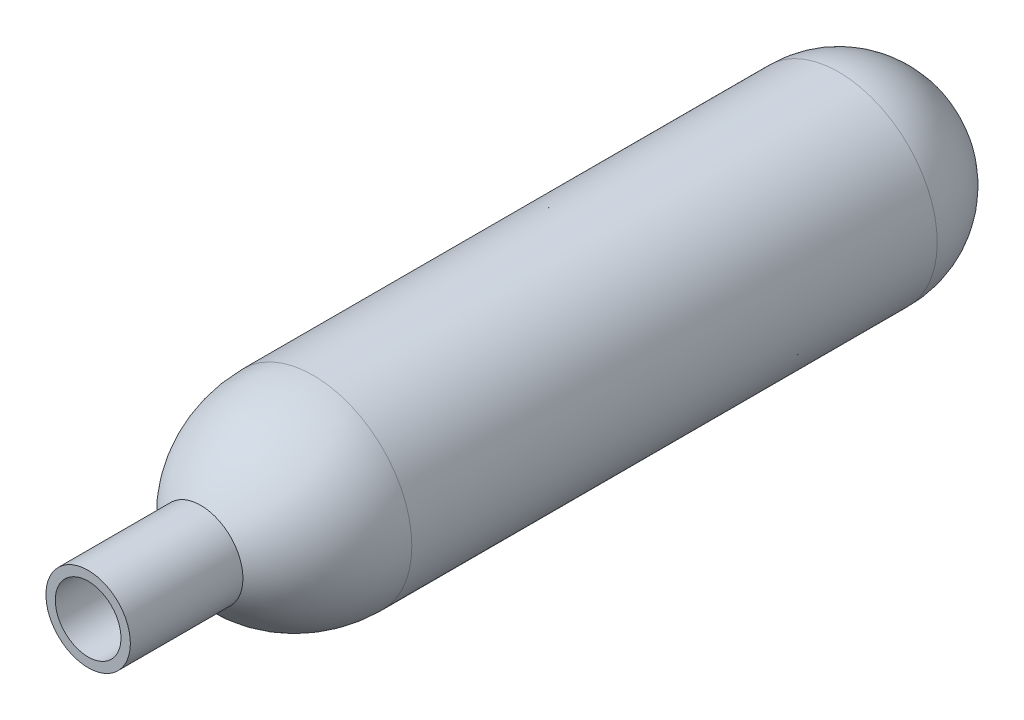
ISO-10303-21;
HEADER;
FILE_DESCRIPTION(('STEP AP214'),'2;1');
FILE_NAME('part.step','',(''),(''),'','','');
FILE_SCHEMA(('AUTOMOTIVE_DESIGN { 1 0 10303 214 1 1 1 1 }'));
ENDSEC;
DATA;
#1=APPLICATION_CONTEXT('core data for automotive mechanical design processes');
#2=APPLICATION_PROTOCOL_DEFINITION('international standard','automotive_design',2000,#1);
#3=PRODUCT_CONTEXT('',#1,'mechanical');
#4=PRODUCT('Part','Part','',(#3));
#5=PRODUCT_RELATED_PRODUCT_CATEGORY('part','',(#4));
#6=PRODUCT_DEFINITION_FORMATION('','',#4);
#7=PRODUCT_DEFINITION_CONTEXT('part definition',#1,'design');
#8=PRODUCT_DEFINITION('design','',#6,#7);
#9=PRODUCT_DEFINITION_SHAPE('','',#8);
#10=(LENGTH_UNIT() NAMED_UNIT(*) SI_UNIT(.MILLI.,.METRE.));
#11=(NAMED_UNIT(*) PLANE_ANGLE_UNIT() SI_UNIT($,.RADIAN.));
#12=(NAMED_UNIT(*) SI_UNIT($,.STERADIAN.) SOLID_ANGLE_UNIT());
#13=UNCERTAINTY_MEASURE_WITH_UNIT(LENGTH_MEASURE(1.E-05),#10,'distance_accuracy_value','');
#14=(GEOMETRIC_REPRESENTATION_CONTEXT(3) GLOBAL_UNCERTAINTY_ASSIGNED_CONTEXT((#13)) GLOBAL_UNIT_ASSIGNED_CONTEXT((#10,
#11,#12)) REPRESENTATION_CONTEXT('',''));
#15=CARTESIAN_POINT('',(0.,0.,0.));
#16=DIRECTION('',(0.,0.,1.));
#17=DIRECTION('',(1.,0.,0.));
#18=AXIS2_PLACEMENT_3D('',#15,#16,#17);
#19=CARTESIAN_POINT('',(0.,0.,-0.743369119518255));
#20=DIRECTION('',(0.,0.,-1.));
#21=DIRECTION('',(-1.,0.,0.));
#22=AXIS2_PLACEMENT_3D('',#19,#20,#21);
#23=PLANE('',#22);
#24=CARTESIAN_POINT('',(0.,0.,-0.743369119518255));
#25=DIRECTION('',(0.,0.,-1.));
#26=DIRECTION('',(-1.,0.,0.));
#27=AXIS2_PLACEMENT_3D('',#24,#25,#26);
#28=CIRCLE('',#27,3.5);
#29=CARTESIAN_POINT('',(-3.5,0.,-0.743369119518255));
#30=VERTEX_POINT('',#29);
#31=EDGE_CURVE('E61',#30,#30,#28,.F.);
#32=ORIENTED_EDGE('',*,*,#31,.F.);
#33=EDGE_LOOP('',(#32));
#34=FACE_BOUND('',#33,.T.);
#35=CARTESIAN_POINT('',(0.,0.,-0.743369119518255));
#36=DIRECTION('',(0.,0.,1.));
#37=DIRECTION('',(1.,0.,0.));
#38=AXIS2_PLACEMENT_3D('',#35,#36,#37);
#39=CIRCLE('',#38,4.5);
#40=CARTESIAN_POINT('',(4.5,0.,-0.743369119518255));
#41=VERTEX_POINT('',#40);
#42=EDGE_CURVE('E54',#41,#41,#39,.T.);
#43=ORIENTED_EDGE('',*,*,#42,.T.);
#44=EDGE_LOOP('',(#43));
#45=FACE_BOUND('',#44,.T.);
#46=ADVANCED_FACE('F37',(#34,#45),#23,.F.);
#47=CARTESIAN_POINT('',(0.,0.,-80.7433691195182));
#48=DIRECTION('',(0.,0.,1.));
#49=DIRECTION('',(0.,1.,0.));
#50=AXIS2_PLACEMENT_3D('',#47,#48,#49);
#51=SPHERICAL_SURFACE('',#50,10.5);
#52=CARTESIAN_POINT('',(0.,0.,-80.7433691195182));
#53=DIRECTION('',(0.,0.,1.));
#54=DIRECTION('',(1.,0.,0.));
#55=AXIS2_PLACEMENT_3D('',#52,#53,#54);
#56=CIRCLE('',#55,10.5);
#57=CARTESIAN_POINT('',(10.5,0.,-80.7433691195182));
#58=VERTEX_POINT('',#57);
#59=EDGE_CURVE('E10',#58,#58,#56,.T.);
#60=ORIENTED_EDGE('',*,*,#59,.F.);
#61=EDGE_LOOP('',(#60));
#62=FACE_BOUND('',#61,.T.);
#63=ADVANCED_FACE('F94',(#62),#51,.T.);
#64=CARTESIAN_POINT('',(0.,0.,0.));
#65=DIRECTION('',(0.,0.,1.));
#66=DIRECTION('',(1.,0.,0.));
#67=AXIS2_PLACEMENT_3D('',#64,#65,#66);
#68=CYLINDRICAL_SURFACE('',#67,10.5);
#69=CARTESIAN_POINT('',(0.,0.,-24.7433691195183));
#70=DIRECTION('',(0.,0.,1.));
#71=DIRECTION('',(1.,0.,0.));
#72=AXIS2_PLACEMENT_3D('',#69,#70,#71);
#73=CIRCLE('',#72,10.5);
#74=CARTESIAN_POINT('',(10.5,0.,-24.7433691195183));
#75=VERTEX_POINT('',#74);
#76=EDGE_CURVE('E44',#75,#75,#73,.T.);
#77=ORIENTED_EDGE('',*,*,#76,.F.);
#78=EDGE_LOOP('',(#77));
#79=FACE_BOUND('',#78,.T.);
#80=ORIENTED_EDGE('',*,*,#59,.T.);
#81=EDGE_LOOP('',(#80));
#82=FACE_BOUND('',#81,.T.);
#83=ADVANCED_FACE('F99',(#79,#82),#68,.T.);
#84=CARTESIAN_POINT('',(0.,0.,-24.7433691195183));
#85=DIRECTION('',(0.,0.,1.));
#86=DIRECTION('',(1.,0.,0.));
#87=AXIS2_PLACEMENT_3D('',#84,#85,#86);
#88=DEGENERATE_TOROIDAL_SURFACE('',#87,4.50000000000001,15.,.F.);
#89=CARTESIAN_POINT('',(0.,0.,-12.7433691195183));
#90=DIRECTION('',(0.,0.,1.));
#91=DIRECTION('',(1.,0.,0.));
#92=AXIS2_PLACEMENT_3D('',#89,#90,#91);
#93=CIRCLE('',#92,4.5);
#94=CARTESIAN_POINT('',(4.5,0.,-12.7433691195183));
#95=VERTEX_POINT('',#94);
#96=EDGE_CURVE('E49',#95,#95,#93,.T.);
#97=ORIENTED_EDGE('',*,*,#96,.F.);
#98=EDGE_LOOP('',(#97));
#99=FACE_BOUND('',#98,.T.);
#100=ORIENTED_EDGE('',*,*,#76,.T.);
#101=EDGE_LOOP('',(#100));
#102=FACE_BOUND('',#101,.T.);
#103=ADVANCED_FACE('F107',(#99,#102),#88,.F.);
#104=CARTESIAN_POINT('',(0.,0.,0.));
#105=DIRECTION('',(0.,0.,1.));
#106=DIRECTION('',(1.,0.,0.));
#107=AXIS2_PLACEMENT_3D('',#104,#105,#106);
#108=CYLINDRICAL_SURFACE('',#107,4.5);
#109=ORIENTED_EDGE('',*,*,#42,.F.);
#110=EDGE_LOOP('',(#109));
#111=FACE_BOUND('',#110,.T.);
#112=ORIENTED_EDGE('',*,*,#96,.T.);
#113=EDGE_LOOP('',(#112));
#114=FACE_BOUND('',#113,.T.);
#115=ADVANCED_FACE('F91',(#111,#114),#108,.T.);
#116=CARTESIAN_POINT('',(0.,0.,-80.7433691195182));
#117=DIRECTION('',(0.,0.,1.));
#118=DIRECTION('',(0.,1.,0.));
#119=AXIS2_PLACEMENT_3D('',#116,#117,#118);
#120=SPHERICAL_SURFACE('',#119,9.50000000000001);
#121=CARTESIAN_POINT('',(0.,0.,-80.7433691195182));
#122=DIRECTION('',(0.,0.,1.));
#123=DIRECTION('',(1.,0.,0.));
#124=AXIS2_PLACEMENT_3D('',#121,#122,#123);
#125=CIRCLE('',#124,9.5);
#126=CARTESIAN_POINT('',(9.5,0.,-80.7433691195182));
#127=VERTEX_POINT('',#126);
#128=EDGE_CURVE('E60',#127,#127,#125,.T.);
#129=ORIENTED_EDGE('',*,*,#128,.T.);
#130=EDGE_LOOP('',(#129));
#131=FACE_BOUND('',#130,.T.);
#132=ADVANCED_FACE('F77',(#131),#120,.F.);
#133=CARTESIAN_POINT('',(0.,0.,0.));
#134=DIRECTION('',(0.,0.,1.));
#135=DIRECTION('',(1.,0.,0.));
#136=AXIS2_PLACEMENT_3D('',#133,#134,#135);
#137=CYLINDRICAL_SURFACE('',#136,9.5);
#138=CARTESIAN_POINT('',(0.,0.,-24.7433691195183));
#139=DIRECTION('',(0.,0.,1.));
#140=DIRECTION('',(1.,0.,0.));
#141=AXIS2_PLACEMENT_3D('',#138,#139,#140);
#142=CIRCLE('',#141,9.5);
#143=CARTESIAN_POINT('',(9.5,0.,-24.7433691195183));
#144=VERTEX_POINT('',#143);
#145=EDGE_CURVE('E69',#144,#144,#142,.T.);
#146=ORIENTED_EDGE('',*,*,#145,.T.);
#147=EDGE_LOOP('',(#146));
#148=FACE_BOUND('',#147,.T.);
#149=ORIENTED_EDGE('',*,*,#128,.F.);
#150=EDGE_LOOP('',(#149));
#151=FACE_BOUND('',#150,.T.);
#152=ADVANCED_FACE('F79',(#148,#151),#137,.F.);
#153=CARTESIAN_POINT('',(0.,0.,-24.7433691195183));
#154=DIRECTION('',(0.,0.,1.));
#155=DIRECTION('',(1.,0.,0.));
#156=AXIS2_PLACEMENT_3D('',#153,#154,#155);
#157=DEGENERATE_TOROIDAL_SURFACE('',#156,4.50000000000001,14.,.F.);
#158=CARTESIAN_POINT('',(0.,0.,-13.2542438264422));
#159=DIRECTION('',(0.,0.,-1.));
#160=DIRECTION('',(-1.,0.,0.));
#161=AXIS2_PLACEMENT_3D('',#158,#159,#160);
#162=CIRCLE('',#161,3.5);
#163=CARTESIAN_POINT('',(-3.5,0.,-13.2542438264422));
#164=VERTEX_POINT('',#163);
#165=EDGE_CURVE('E65',#164,#164,#162,.F.);
#166=ORIENTED_EDGE('',*,*,#165,.T.);
#167=EDGE_LOOP('',(#166));
#168=FACE_BOUND('',#167,.T.);
#169=ORIENTED_EDGE('',*,*,#145,.F.);
#170=EDGE_LOOP('',(#169));
#171=FACE_BOUND('',#170,.T.);
#172=ADVANCED_FACE('F81',(#168,#171),#157,.T.);
#173=CARTESIAN_POINT('',(0.,0.,0.));
#174=DIRECTION('',(0.,0.,1.));
#175=DIRECTION('',(1.,0.,0.));
#176=AXIS2_PLACEMENT_3D('',#173,#174,#175);
#177=CYLINDRICAL_SURFACE('',#176,3.5);
#178=ORIENTED_EDGE('',*,*,#31,.T.);
#179=EDGE_LOOP('',(#178));
#180=FACE_BOUND('',#179,.T.);
#181=ORIENTED_EDGE('',*,*,#165,.F.);
#182=EDGE_LOOP('',(#181));
#183=FACE_BOUND('',#182,.T.);
#184=ADVANCED_FACE('F88',(#180,#183),#177,.F.);
#185=CLOSED_SHELL('',(#46,#63,#83,#103,#115,#132,#152,#172,#184));
#186=MANIFOLD_SOLID_BREP('B2',#185);
#187=ADVANCED_BREP_SHAPE_REPRESENTATION('',(#18,#186),#14);
#188=SHAPE_DEFINITION_REPRESENTATION(#9,#187);
ENDSEC;
END-ISO-10303-21;
